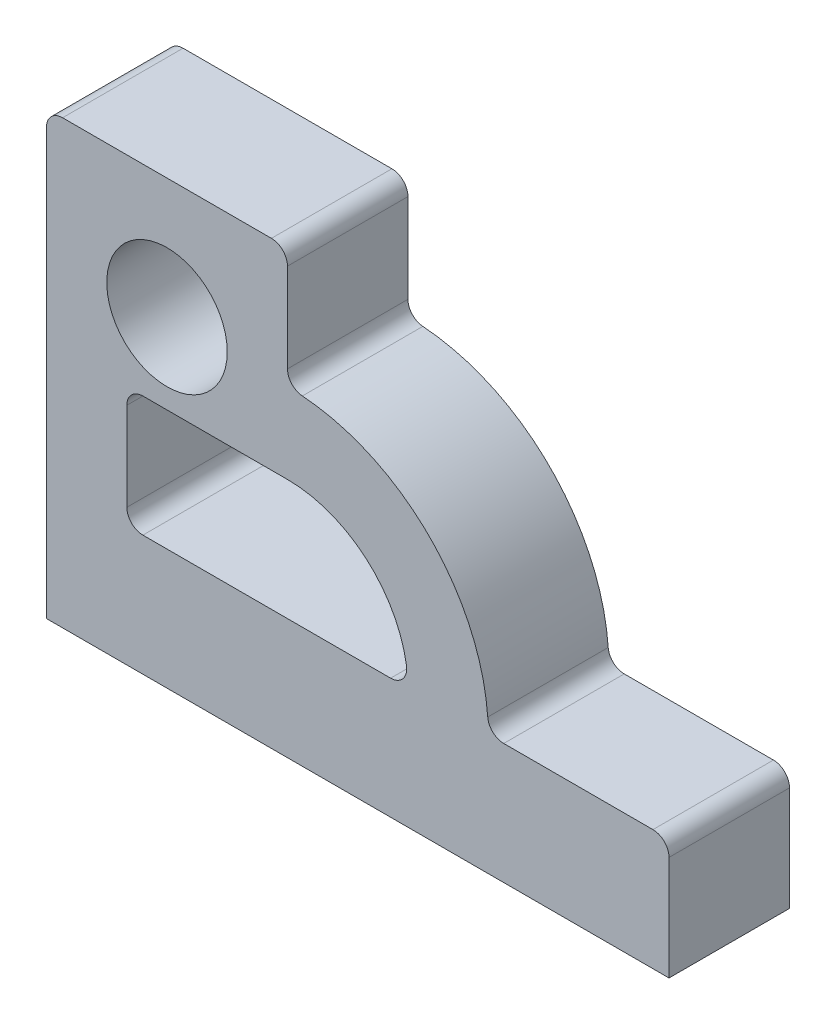
ISO-10303-21;
HEADER;
FILE_DESCRIPTION(('STEP AP214'),'2;1');
FILE_NAME('part.step','',(''),(''),'','','');
FILE_SCHEMA(('AUTOMOTIVE_DESIGN { 1 0 10303 214 1 1 1 1 }'));
ENDSEC;
DATA;
#1=APPLICATION_CONTEXT('core data for automotive mechanical design processes');
#2=APPLICATION_PROTOCOL_DEFINITION('international standard','automotive_design',2000,#1);
#3=PRODUCT_CONTEXT('',#1,'mechanical');
#4=PRODUCT('Part','Part','',(#3));
#5=PRODUCT_RELATED_PRODUCT_CATEGORY('part','',(#4));
#6=PRODUCT_DEFINITION_FORMATION('','',#4);
#7=PRODUCT_DEFINITION_CONTEXT('part definition',#1,'design');
#8=PRODUCT_DEFINITION('design','',#6,#7);
#9=PRODUCT_DEFINITION_SHAPE('','',#8);
#10=(LENGTH_UNIT() NAMED_UNIT(*) SI_UNIT(.MILLI.,.METRE.));
#11=(NAMED_UNIT(*) PLANE_ANGLE_UNIT() SI_UNIT($,.RADIAN.));
#12=(NAMED_UNIT(*) SI_UNIT($,.STERADIAN.) SOLID_ANGLE_UNIT());
#13=UNCERTAINTY_MEASURE_WITH_UNIT(LENGTH_MEASURE(1.E-05),#10,'distance_accuracy_value','');
#14=(GEOMETRIC_REPRESENTATION_CONTEXT(3) GLOBAL_UNCERTAINTY_ASSIGNED_CONTEXT((#13)) GLOBAL_UNIT_ASSIGNED_CONTEXT((#10,
#11,#12)) REPRESENTATION_CONTEXT('',''));
#15=CARTESIAN_POINT('',(0.,0.,0.));
#16=DIRECTION('',(0.,0.,1.));
#17=DIRECTION('',(1.,0.,0.));
#18=AXIS2_PLACEMENT_3D('',#15,#16,#17);
#19=CARTESIAN_POINT('',(4.,106.,15.));
#20=DIRECTION('',(0.,0.,-1.));
#21=DIRECTION('',(-1.,0.,0.));
#22=AXIS2_PLACEMENT_3D('',#19,#20,#21);
#23=PLANE('',#22);
#24=DIRECTION('',(1.,0.,0.));
#25=VECTOR('',#24,1.);
#26=CARTESIAN_POINT('',(155.,0.,15.));
#27=LINE('',#26,#25);
#28=CARTESIAN_POINT('',(0.,0.,15.));
#29=VERTEX_POINT('',#28);
#30=CARTESIAN_POINT('',(155.,0.,15.));
#31=VERTEX_POINT('',#30);
#32=EDGE_CURVE('E225',#29,#31,#27,.T.);
#33=ORIENTED_EDGE('',*,*,#32,.T.);
#34=DIRECTION('',(0.,1.,0.));
#35=VECTOR('',#34,1.);
#36=CARTESIAN_POINT('',(155.,26.,15.));
#37=LINE('',#36,#35);
#38=CARTESIAN_POINT('',(155.,26.,15.));
#39=VERTEX_POINT('',#38);
#40=EDGE_CURVE('E228',#31,#39,#37,.T.);
#41=ORIENTED_EDGE('',*,*,#40,.T.);
#42=CARTESIAN_POINT('',(151.,26.,15.));
#43=DIRECTION('',(0.,0.,1.));
#44=DIRECTION('',(-1.,0.,0.));
#45=AXIS2_PLACEMENT_3D('',#42,#43,#44);
#46=CIRCLE('',#45,4.);
#47=CARTESIAN_POINT('',(151.,30.,15.));
#48=VERTEX_POINT('',#47);
#49=EDGE_CURVE('E231',#39,#48,#46,.T.);
#50=ORIENTED_EDGE('',*,*,#49,.T.);
#51=DIRECTION('',(-1.,0.,0.));
#52=VECTOR('',#51,1.);
#53=CARTESIAN_POINT('',(113.851648071345,30.,15.));
#54=LINE('',#53,#52);
#55=CARTESIAN_POINT('',(113.851648071345,30.,15.));
#56=VERTEX_POINT('',#55);
#57=EDGE_CURVE('E233',#48,#56,#54,.T.);
#58=ORIENTED_EDGE('',*,*,#57,.T.);
#59=CARTESIAN_POINT('',(113.851648071345,34.,15.));
#60=DIRECTION('',(0.,0.,-1.));
#61=DIRECTION('',(1.,0.,0.));
#62=AXIS2_PLACEMENT_3D('',#59,#60,#61);
#63=CIRCLE('',#62,4.);
#64=CARTESIAN_POINT('',(109.862637103097,33.7037037037037,15.));
#65=VERTEX_POINT('',#64);
#66=EDGE_CURVE('E235',#56,#65,#63,.T.);
#67=ORIENTED_EDGE('',*,*,#66,.T.);
#68=CARTESIAN_POINT('',(60.,30.,15.));
#69=DIRECTION('',(0.,0.,1.));
#70=DIRECTION('',(-1.,0.,0.));
#71=AXIS2_PLACEMENT_3D('',#68,#69,#70);
#72=CIRCLE('',#71,50.);
#73=CARTESIAN_POINT('',(63.7037037037037,79.8626371030973,15.));
#74=VERTEX_POINT('',#73);
#75=EDGE_CURVE('E237',#65,#74,#72,.T.);
#76=ORIENTED_EDGE('',*,*,#75,.T.);
#77=CARTESIAN_POINT('',(64.,83.851648071345,15.));
#78=DIRECTION('',(0.,0.,-1.));
#79=DIRECTION('',(1.,0.,0.));
#80=AXIS2_PLACEMENT_3D('',#77,#78,#79);
#81=CIRCLE('',#80,4.00000000000001);
#82=CARTESIAN_POINT('',(60.,83.851648071345,15.));
#83=VERTEX_POINT('',#82);
#84=EDGE_CURVE('E239',#74,#83,#81,.T.);
#85=ORIENTED_EDGE('',*,*,#84,.T.);
#86=DIRECTION('',(0.,1.,0.));
#87=VECTOR('',#86,1.);
#88=CARTESIAN_POINT('',(60.,106.,15.));
#89=LINE('',#88,#87);
#90=CARTESIAN_POINT('',(60.,106.,15.));
#91=VERTEX_POINT('',#90);
#92=EDGE_CURVE('E241',#83,#91,#89,.T.);
#93=ORIENTED_EDGE('',*,*,#92,.T.);
#94=CARTESIAN_POINT('',(56.,106.,15.));
#95=DIRECTION('',(0.,0.,1.));
#96=DIRECTION('',(-1.,0.,0.));
#97=AXIS2_PLACEMENT_3D('',#94,#95,#96);
#98=CIRCLE('',#97,4.);
#99=CARTESIAN_POINT('',(55.9999999999999,110.,15.));
#100=VERTEX_POINT('',#99);
#101=EDGE_CURVE('E243',#91,#100,#98,.T.);
#102=ORIENTED_EDGE('',*,*,#101,.T.);
#103=DIRECTION('',(-1.,0.,0.));
#104=VECTOR('',#103,1.);
#105=CARTESIAN_POINT('',(4.00000000000003,110.,15.));
#106=LINE('',#105,#104);
#107=CARTESIAN_POINT('',(4.00000000000003,110.,15.));
#108=VERTEX_POINT('',#107);
#109=EDGE_CURVE('E245',#100,#108,#106,.T.);
#110=ORIENTED_EDGE('',*,*,#109,.T.);
#111=CARTESIAN_POINT('',(4.,106.,15.));
#112=DIRECTION('',(0.,0.,1.));
#113=DIRECTION('',(-1.,0.,0.));
#114=AXIS2_PLACEMENT_3D('',#111,#112,#113);
#115=CIRCLE('',#114,4.);
#116=CARTESIAN_POINT('',(0.,106.,15.));
#117=VERTEX_POINT('',#116);
#118=EDGE_CURVE('E247',#108,#117,#115,.T.);
#119=ORIENTED_EDGE('',*,*,#118,.T.);
#120=DIRECTION('',(0.,-1.,0.));
#121=VECTOR('',#120,1.);
#122=CARTESIAN_POINT('',(0.,0.,15.));
#123=LINE('',#122,#121);
#124=EDGE_CURVE('E249',#117,#29,#123,.T.);
#125=ORIENTED_EDGE('',*,*,#124,.T.);
#126=EDGE_LOOP('',(#33,#41,#50,#58,#67,#76,#85,#93,#102,#110,#119,#125));
#127=FACE_BOUND('',#126,.T.);
#128=CARTESIAN_POINT('',(60.,30.,15.));
#129=DIRECTION('',(0.,0.,1.));
#130=DIRECTION('',(-1.,0.,0.));
#131=AXIS2_PLACEMENT_3D('',#128,#129,#130);
#132=CIRCLE('',#131,30.);
#133=CARTESIAN_POINT('',(89.6428444123041,34.6153846153846,15.));
#134=VERTEX_POINT('',#133);
#135=CARTESIAN_POINT('',(60.,60.,15.));
#136=VERTEX_POINT('',#135);
#137=EDGE_CURVE('E164',#134,#136,#132,.T.);
#138=ORIENTED_EDGE('',*,*,#137,.F.);
#139=CARTESIAN_POINT('',(85.6904651573303,34.,15.));
#140=DIRECTION('',(0.,0.,1.));
#141=DIRECTION('',(1.,0.,0.));
#142=AXIS2_PLACEMENT_3D('',#139,#140,#141);
#143=CIRCLE('',#142,4.);
#144=CARTESIAN_POINT('',(85.6904651573303,30.,15.));
#145=VERTEX_POINT('',#144);
#146=EDGE_CURVE('E197',#145,#134,#143,.T.);
#147=ORIENTED_EDGE('',*,*,#146,.F.);
#148=DIRECTION('',(1.,0.,0.));
#149=VECTOR('',#148,1.);
#150=CARTESIAN_POINT('',(85.6904651573303,30.,15.));
#151=LINE('',#150,#149);
#152=CARTESIAN_POINT('',(24.,30.,15.));
#153=VERTEX_POINT('',#152);
#154=EDGE_CURVE('E195',#153,#145,#151,.T.);
#155=ORIENTED_EDGE('',*,*,#154,.F.);
#156=CARTESIAN_POINT('',(24.,34.,15.));
#157=DIRECTION('',(0.,0.,1.));
#158=DIRECTION('',(-1.,0.,0.));
#159=AXIS2_PLACEMENT_3D('',#156,#157,#158);
#160=CIRCLE('',#159,4.);
#161=CARTESIAN_POINT('',(20.,34.,15.));
#162=VERTEX_POINT('',#161);
#163=EDGE_CURVE('E193',#162,#153,#160,.T.);
#164=ORIENTED_EDGE('',*,*,#163,.F.);
#165=DIRECTION('',(0.,-1.,0.));
#166=VECTOR('',#165,1.);
#167=CARTESIAN_POINT('',(20.,34.,15.));
#168=LINE('',#167,#166);
#169=CARTESIAN_POINT('',(20.,56.,15.));
#170=VERTEX_POINT('',#169);
#171=EDGE_CURVE('E188',#170,#162,#168,.T.);
#172=ORIENTED_EDGE('',*,*,#171,.F.);
#173=CARTESIAN_POINT('',(24.,56.,15.));
#174=DIRECTION('',(0.,0.,1.));
#175=DIRECTION('',(-1.,0.,0.));
#176=AXIS2_PLACEMENT_3D('',#173,#174,#175);
#177=CIRCLE('',#176,4.);
#178=CARTESIAN_POINT('',(24.,60.,15.));
#179=VERTEX_POINT('',#178);
#180=EDGE_CURVE('E186',#179,#170,#177,.T.);
#181=ORIENTED_EDGE('',*,*,#180,.F.);
#182=DIRECTION('',(-1.,0.,0.));
#183=VECTOR('',#182,1.);
#184=CARTESIAN_POINT('',(24.,60.,15.));
#185=LINE('',#184,#183);
#186=EDGE_CURVE('E172',#136,#179,#185,.T.);
#187=ORIENTED_EDGE('',*,*,#186,.F.);
#188=EDGE_LOOP('',(#138,#147,#155,#164,#172,#181,#187));
#189=FACE_BOUND('',#188,.T.);
#190=CARTESIAN_POINT('',(30.,80.,15.));
#191=DIRECTION('',(0.,0.,1.));
#192=DIRECTION('',(1.,0.,0.));
#193=AXIS2_PLACEMENT_3D('',#190,#191,#192);
#194=CIRCLE('',#193,15.);
#195=CARTESIAN_POINT('',(45.,80.,15.));
#196=VERTEX_POINT('',#195);
#197=EDGE_CURVE('E200',#196,#196,#194,.T.);
#198=ORIENTED_EDGE('',*,*,#197,.F.);
#199=EDGE_LOOP('',(#198));
#200=FACE_BOUND('',#199,.T.);
#201=ADVANCED_FACE('F33',(#127,#189,#200),#23,.F.);
#202=CARTESIAN_POINT('',(4.,106.,-15.));
#203=DIRECTION('',(0.,0.,-1.));
#204=DIRECTION('',(-1.,0.,0.));
#205=AXIS2_PLACEMENT_3D('',#202,#203,#204);
#206=PLANE('',#205);
#207=CARTESIAN_POINT('',(85.6904651573303,34.,-15.));
#208=DIRECTION('',(0.,0.,1.));
#209=DIRECTION('',(1.,0.,0.));
#210=AXIS2_PLACEMENT_3D('',#207,#208,#209);
#211=CIRCLE('',#210,4.);
#212=CARTESIAN_POINT('',(85.6904651573303,30.,-15.));
#213=VERTEX_POINT('',#212);
#214=CARTESIAN_POINT('',(89.6428444123041,34.6153846153846,-15.));
#215=VERTEX_POINT('',#214);
#216=EDGE_CURVE('E173',#213,#215,#211,.T.);
#217=ORIENTED_EDGE('',*,*,#216,.T.);
#218=CARTESIAN_POINT('',(60.,30.,-15.));
#219=DIRECTION('',(0.,0.,1.));
#220=DIRECTION('',(-1.,0.,0.));
#221=AXIS2_PLACEMENT_3D('',#218,#219,#220);
#222=CIRCLE('',#221,30.);
#223=CARTESIAN_POINT('',(60.,60.,-15.));
#224=VERTEX_POINT('',#223);
#225=EDGE_CURVE('E56',#215,#224,#222,.T.);
#226=ORIENTED_EDGE('',*,*,#225,.T.);
#227=DIRECTION('',(-1.,0.,0.));
#228=VECTOR('',#227,1.);
#229=CARTESIAN_POINT('',(24.,60.,-15.));
#230=LINE('',#229,#228);
#231=CARTESIAN_POINT('',(24.,60.,-15.));
#232=VERTEX_POINT('',#231);
#233=EDGE_CURVE('E179',#224,#232,#230,.T.);
#234=ORIENTED_EDGE('',*,*,#233,.T.);
#235=CARTESIAN_POINT('',(24.,56.,-15.));
#236=DIRECTION('',(0.,0.,1.));
#237=DIRECTION('',(-1.,0.,0.));
#238=AXIS2_PLACEMENT_3D('',#235,#236,#237);
#239=CIRCLE('',#238,4.);
#240=CARTESIAN_POINT('',(20.,56.,-15.));
#241=VERTEX_POINT('',#240);
#242=EDGE_CURVE('E202',#232,#241,#239,.T.);
#243=ORIENTED_EDGE('',*,*,#242,.T.);
#244=DIRECTION('',(0.,-1.,0.));
#245=VECTOR('',#244,1.);
#246=CARTESIAN_POINT('',(20.,34.,-15.));
#247=LINE('',#246,#245);
#248=CARTESIAN_POINT('',(20.,34.,-15.));
#249=VERTEX_POINT('',#248);
#250=EDGE_CURVE('E205',#241,#249,#247,.T.);
#251=ORIENTED_EDGE('',*,*,#250,.T.);
#252=CARTESIAN_POINT('',(24.,34.,-15.));
#253=DIRECTION('',(0.,0.,1.));
#254=DIRECTION('',(-1.,0.,0.));
#255=AXIS2_PLACEMENT_3D('',#252,#253,#254);
#256=CIRCLE('',#255,4.);
#257=CARTESIAN_POINT('',(24.,30.,-15.));
#258=VERTEX_POINT('',#257);
#259=EDGE_CURVE('E208',#249,#258,#256,.T.);
#260=ORIENTED_EDGE('',*,*,#259,.T.);
#261=DIRECTION('',(1.,0.,0.));
#262=VECTOR('',#261,1.);
#263=CARTESIAN_POINT('',(85.6904651573303,30.,-15.));
#264=LINE('',#263,#262);
#265=EDGE_CURVE('E211',#258,#213,#264,.T.);
#266=ORIENTED_EDGE('',*,*,#265,.T.);
#267=EDGE_LOOP('',(#217,#226,#234,#243,#251,#260,#266));
#268=FACE_BOUND('',#267,.T.);
#269=DIRECTION('',(1.,0.,0.));
#270=VECTOR('',#269,1.);
#271=CARTESIAN_POINT('',(155.,0.,-15.));
#272=LINE('',#271,#270);
#273=CARTESIAN_POINT('',(0.,0.,-15.));
#274=VERTEX_POINT('',#273);
#275=CARTESIAN_POINT('',(155.,0.,-15.));
#276=VERTEX_POINT('',#275);
#277=EDGE_CURVE('E180',#274,#276,#272,.T.);
#278=ORIENTED_EDGE('',*,*,#277,.F.);
#279=DIRECTION('',(0.,-1.,0.));
#280=VECTOR('',#279,1.);
#281=CARTESIAN_POINT('',(0.,0.,-15.));
#282=LINE('',#281,#280);
#283=CARTESIAN_POINT('',(0.,106.,-15.));
#284=VERTEX_POINT('',#283);
#285=EDGE_CURVE('E229',#284,#274,#282,.T.);
#286=ORIENTED_EDGE('',*,*,#285,.F.);
#287=CARTESIAN_POINT('',(4.,106.,-15.));
#288=DIRECTION('',(0.,0.,1.));
#289=DIRECTION('',(-1.,0.,0.));
#290=AXIS2_PLACEMENT_3D('',#287,#288,#289);
#291=CIRCLE('',#290,4.);
#292=CARTESIAN_POINT('',(4.00000000000003,110.,-15.));
#293=VERTEX_POINT('',#292);
#294=EDGE_CURVE('E272',#293,#284,#291,.T.);
#295=ORIENTED_EDGE('',*,*,#294,.F.);
#296=DIRECTION('',(-1.,0.,0.));
#297=VECTOR('',#296,1.);
#298=CARTESIAN_POINT('',(4.00000000000003,110.,-15.));
#299=LINE('',#298,#297);
#300=CARTESIAN_POINT('',(55.9999999999999,110.,-15.));
#301=VERTEX_POINT('',#300);
#302=EDGE_CURVE('E270',#301,#293,#299,.T.);
#303=ORIENTED_EDGE('',*,*,#302,.F.);
#304=CARTESIAN_POINT('',(56.,106.,-15.));
#305=DIRECTION('',(0.,0.,1.));
#306=DIRECTION('',(-1.,0.,0.));
#307=AXIS2_PLACEMENT_3D('',#304,#305,#306);
#308=CIRCLE('',#307,4.);
#309=CARTESIAN_POINT('',(60.,106.,-15.));
#310=VERTEX_POINT('',#309);
#311=EDGE_CURVE('E268',#310,#301,#308,.T.);
#312=ORIENTED_EDGE('',*,*,#311,.F.);
#313=DIRECTION('',(0.,1.,0.));
#314=VECTOR('',#313,1.);
#315=CARTESIAN_POINT('',(60.,106.,-15.));
#316=LINE('',#315,#314);
#317=CARTESIAN_POINT('',(60.,83.851648071345,-15.));
#318=VERTEX_POINT('',#317);
#319=EDGE_CURVE('E266',#318,#310,#316,.T.);
#320=ORIENTED_EDGE('',*,*,#319,.F.);
#321=CARTESIAN_POINT('',(64.,83.851648071345,-15.));
#322=DIRECTION('',(0.,0.,-1.));
#323=DIRECTION('',(1.,0.,0.));
#324=AXIS2_PLACEMENT_3D('',#321,#322,#323);
#325=CIRCLE('',#324,4.00000000000001);
#326=CARTESIAN_POINT('',(63.7037037037037,79.8626371030973,-15.));
#327=VERTEX_POINT('',#326);
#328=EDGE_CURVE('E264',#327,#318,#325,.T.);
#329=ORIENTED_EDGE('',*,*,#328,.F.);
#330=CARTESIAN_POINT('',(60.,30.,-15.));
#331=DIRECTION('',(0.,0.,1.));
#332=DIRECTION('',(-1.,0.,0.));
#333=AXIS2_PLACEMENT_3D('',#330,#331,#332);
#334=CIRCLE('',#333,50.);
#335=CARTESIAN_POINT('',(109.862637103097,33.7037037037037,-15.));
#336=VERTEX_POINT('',#335);
#337=EDGE_CURVE('E262',#336,#327,#334,.T.);
#338=ORIENTED_EDGE('',*,*,#337,.F.);
#339=CARTESIAN_POINT('',(113.851648071345,34.,-15.));
#340=DIRECTION('',(0.,0.,-1.));
#341=DIRECTION('',(1.,0.,0.));
#342=AXIS2_PLACEMENT_3D('',#339,#340,#341);
#343=CIRCLE('',#342,4.);
#344=CARTESIAN_POINT('',(113.851648071345,30.,-15.));
#345=VERTEX_POINT('',#344);
#346=EDGE_CURVE('E260',#345,#336,#343,.T.);
#347=ORIENTED_EDGE('',*,*,#346,.F.);
#348=DIRECTION('',(-1.,0.,0.));
#349=VECTOR('',#348,1.);
#350=CARTESIAN_POINT('',(113.851648071345,30.,-15.));
#351=LINE('',#350,#349);
#352=CARTESIAN_POINT('',(151.,30.,-15.));
#353=VERTEX_POINT('',#352);
#354=EDGE_CURVE('E258',#353,#345,#351,.T.);
#355=ORIENTED_EDGE('',*,*,#354,.F.);
#356=CARTESIAN_POINT('',(151.,26.,-15.));
#357=DIRECTION('',(0.,0.,1.));
#358=DIRECTION('',(-1.,0.,0.));
#359=AXIS2_PLACEMENT_3D('',#356,#357,#358);
#360=CIRCLE('',#359,4.);
#361=CARTESIAN_POINT('',(155.,26.,-15.));
#362=VERTEX_POINT('',#361);
#363=EDGE_CURVE('E256',#362,#353,#360,.T.);
#364=ORIENTED_EDGE('',*,*,#363,.F.);
#365=DIRECTION('',(0.,1.,0.));
#366=VECTOR('',#365,1.);
#367=CARTESIAN_POINT('',(155.,26.,-15.));
#368=LINE('',#367,#366);
#369=EDGE_CURVE('E254',#276,#362,#368,.T.);
#370=ORIENTED_EDGE('',*,*,#369,.F.);
#371=EDGE_LOOP('',(#278,#286,#295,#303,#312,#320,#329,#338,#347,#355,#364,#370));
#372=FACE_BOUND('',#371,.T.);
#373=CARTESIAN_POINT('',(30.,80.,-15.));
#374=DIRECTION('',(0.,0.,1.));
#375=DIRECTION('',(1.,0.,0.));
#376=AXIS2_PLACEMENT_3D('',#373,#374,#375);
#377=CIRCLE('',#376,15.);
#378=CARTESIAN_POINT('',(45.,80.,-15.));
#379=VERTEX_POINT('',#378);
#380=EDGE_CURVE('E556',#379,#379,#377,.T.);
#381=ORIENTED_EDGE('',*,*,#380,.T.);
#382=EDGE_LOOP('',(#381));
#383=FACE_BOUND('',#382,.T.);
#384=ADVANCED_FACE('F314',(#268,#372,#383),#206,.T.);
#385=CARTESIAN_POINT('',(155.,0.,15.));
#386=DIRECTION('',(0.,1.,0.));
#387=DIRECTION('',(-1.,0.,0.));
#388=AXIS2_PLACEMENT_3D('',#385,#386,#387);
#389=PLANE('',#388);
#390=ORIENTED_EDGE('',*,*,#277,.T.);
#391=DIRECTION('',(0.,0.,-1.));
#392=VECTOR('',#391,1.);
#393=CARTESIAN_POINT('',(155.,0.,15.));
#394=LINE('',#393,#392);
#395=EDGE_CURVE('E11',#31,#276,#394,.T.);
#396=ORIENTED_EDGE('',*,*,#395,.F.);
#397=ORIENTED_EDGE('',*,*,#32,.F.);
#398=DIRECTION('',(0.,0.,-1.));
#399=VECTOR('',#398,1.);
#400=CARTESIAN_POINT('',(0.,0.,15.));
#401=LINE('',#400,#399);
#402=EDGE_CURVE('E251',#29,#274,#401,.T.);
#403=ORIENTED_EDGE('',*,*,#402,.T.);
#404=EDGE_LOOP('',(#390,#396,#397,#403));
#405=FACE_BOUND('',#404,.T.);
#406=ADVANCED_FACE('F35',(#405),#389,.F.);
#407=CARTESIAN_POINT('',(155.,26.,15.));
#408=DIRECTION('',(-1.,0.,0.));
#409=DIRECTION('',(0.,0.,1.));
#410=AXIS2_PLACEMENT_3D('',#407,#408,#409);
#411=PLANE('',#410);
#412=ORIENTED_EDGE('',*,*,#369,.T.);
#413=DIRECTION('',(0.,0.,-1.));
#414=VECTOR('',#413,1.);
#415=CARTESIAN_POINT('',(155.,26.,15.));
#416=LINE('',#415,#414);
#417=EDGE_CURVE('E41',#39,#362,#416,.T.);
#418=ORIENTED_EDGE('',*,*,#417,.F.);
#419=ORIENTED_EDGE('',*,*,#40,.F.);
#420=ORIENTED_EDGE('',*,*,#395,.T.);
#421=EDGE_LOOP('',(#412,#418,#419,#420));
#422=FACE_BOUND('',#421,.T.);
#423=ADVANCED_FACE('F331',(#422),#411,.F.);
#424=CARTESIAN_POINT('',(151.,26.,15.));
#425=DIRECTION('',(0.,0.,-1.));
#426=DIRECTION('',(-1.,0.,0.));
#427=AXIS2_PLACEMENT_3D('',#424,#425,#426);
#428=CYLINDRICAL_SURFACE('',#427,4.);
#429=ORIENTED_EDGE('',*,*,#363,.T.);
#430=DIRECTION('',(0.,0.,-1.));
#431=VECTOR('',#430,1.);
#432=CARTESIAN_POINT('',(151.,30.,15.));
#433=LINE('',#432,#431);
#434=EDGE_CURVE('E301',#48,#353,#433,.T.);
#435=ORIENTED_EDGE('',*,*,#434,.F.);
#436=ORIENTED_EDGE('',*,*,#49,.F.);
#437=ORIENTED_EDGE('',*,*,#417,.T.);
#438=EDGE_LOOP('',(#429,#435,#436,#437));
#439=FACE_BOUND('',#438,.T.);
#440=ADVANCED_FACE('F308',(#439),#428,.T.);
#441=CARTESIAN_POINT('',(113.851648071345,30.,15.));
#442=DIRECTION('',(0.,-1.,0.));
#443=DIRECTION('',(0.,0.,-1.));
#444=AXIS2_PLACEMENT_3D('',#441,#442,#443);
#445=PLANE('',#444);
#446=ORIENTED_EDGE('',*,*,#354,.T.);
#447=DIRECTION('',(0.,0.,-1.));
#448=VECTOR('',#447,1.);
#449=CARTESIAN_POINT('',(113.851648071345,30.,15.));
#450=LINE('',#449,#448);
#451=EDGE_CURVE('E298',#56,#345,#450,.T.);
#452=ORIENTED_EDGE('',*,*,#451,.F.);
#453=ORIENTED_EDGE('',*,*,#57,.F.);
#454=ORIENTED_EDGE('',*,*,#434,.T.);
#455=EDGE_LOOP('',(#446,#452,#453,#454));
#456=FACE_BOUND('',#455,.T.);
#457=ADVANCED_FACE('F320',(#456),#445,.F.);
#458=CARTESIAN_POINT('',(113.851648071345,34.,15.));
#459=DIRECTION('',(0.,0.,-1.));
#460=DIRECTION('',(-1.,0.,0.));
#461=AXIS2_PLACEMENT_3D('',#458,#459,#460);
#462=CYLINDRICAL_SURFACE('',#461,4.);
#463=ORIENTED_EDGE('',*,*,#346,.T.);
#464=DIRECTION('',(0.,0.,-1.));
#465=VECTOR('',#464,1.);
#466=CARTESIAN_POINT('',(109.862637103097,33.7037037037037,15.));
#467=LINE('',#466,#465);
#468=EDGE_CURVE('E295',#65,#336,#467,.T.);
#469=ORIENTED_EDGE('',*,*,#468,.F.);
#470=ORIENTED_EDGE('',*,*,#66,.F.);
#471=ORIENTED_EDGE('',*,*,#451,.T.);
#472=EDGE_LOOP('',(#463,#469,#470,#471));
#473=FACE_BOUND('',#472,.T.);
#474=ADVANCED_FACE('F324',(#473),#462,.F.);
#475=CARTESIAN_POINT('',(60.,30.,15.));
#476=DIRECTION('',(0.,0.,-1.));
#477=DIRECTION('',(-1.,0.,0.));
#478=AXIS2_PLACEMENT_3D('',#475,#476,#477);
#479=CYLINDRICAL_SURFACE('',#478,50.);
#480=ORIENTED_EDGE('',*,*,#337,.T.);
#481=DIRECTION('',(0.,0.,-1.));
#482=VECTOR('',#481,1.);
#483=CARTESIAN_POINT('',(63.7037037037037,79.8626371030973,15.));
#484=LINE('',#483,#482);
#485=EDGE_CURVE('E292',#74,#327,#484,.T.);
#486=ORIENTED_EDGE('',*,*,#485,.F.);
#487=ORIENTED_EDGE('',*,*,#75,.F.);
#488=ORIENTED_EDGE('',*,*,#468,.T.);
#489=EDGE_LOOP('',(#480,#486,#487,#488));
#490=FACE_BOUND('',#489,.T.);
#491=ADVANCED_FACE('F364',(#490),#479,.T.);
#492=CARTESIAN_POINT('',(64.,83.851648071345,15.));
#493=DIRECTION('',(0.,0.,-1.));
#494=DIRECTION('',(-1.,0.,0.));
#495=AXIS2_PLACEMENT_3D('',#492,#493,#494);
#496=CYLINDRICAL_SURFACE('',#495,4.00000000000001);
#497=ORIENTED_EDGE('',*,*,#328,.T.);
#498=DIRECTION('',(0.,0.,-1.));
#499=VECTOR('',#498,1.);
#500=CARTESIAN_POINT('',(60.,83.851648071345,15.));
#501=LINE('',#500,#499);
#502=EDGE_CURVE('E289',#83,#318,#501,.T.);
#503=ORIENTED_EDGE('',*,*,#502,.F.);
#504=ORIENTED_EDGE('',*,*,#84,.F.);
#505=ORIENTED_EDGE('',*,*,#485,.T.);
#506=EDGE_LOOP('',(#497,#503,#504,#505));
#507=FACE_BOUND('',#506,.T.);
#508=ADVANCED_FACE('F362',(#507),#496,.F.);
#509=CARTESIAN_POINT('',(60.,106.,15.));
#510=DIRECTION('',(-1.,0.,0.));
#511=DIRECTION('',(0.,0.,1.));
#512=AXIS2_PLACEMENT_3D('',#509,#510,#511);
#513=PLANE('',#512);
#514=ORIENTED_EDGE('',*,*,#319,.T.);
#515=DIRECTION('',(0.,0.,-1.));
#516=VECTOR('',#515,1.);
#517=CARTESIAN_POINT('',(60.,106.,15.));
#518=LINE('',#517,#516);
#519=EDGE_CURVE('E286',#91,#310,#518,.T.);
#520=ORIENTED_EDGE('',*,*,#519,.F.);
#521=ORIENTED_EDGE('',*,*,#92,.F.);
#522=ORIENTED_EDGE('',*,*,#502,.T.);
#523=EDGE_LOOP('',(#514,#520,#521,#522));
#524=FACE_BOUND('',#523,.T.);
#525=ADVANCED_FACE('F358',(#524),#513,.F.);
#526=CARTESIAN_POINT('',(56.,106.,15.));
#527=DIRECTION('',(0.,0.,-1.));
#528=DIRECTION('',(-1.,0.,0.));
#529=AXIS2_PLACEMENT_3D('',#526,#527,#528);
#530=CYLINDRICAL_SURFACE('',#529,4.);
#531=ORIENTED_EDGE('',*,*,#311,.T.);
#532=DIRECTION('',(0.,0.,-1.));
#533=VECTOR('',#532,1.);
#534=CARTESIAN_POINT('',(55.9999999999999,110.,15.));
#535=LINE('',#534,#533);
#536=EDGE_CURVE('E283',#100,#301,#535,.T.);
#537=ORIENTED_EDGE('',*,*,#536,.F.);
#538=ORIENTED_EDGE('',*,*,#101,.F.);
#539=ORIENTED_EDGE('',*,*,#519,.T.);
#540=EDGE_LOOP('',(#531,#537,#538,#539));
#541=FACE_BOUND('',#540,.T.);
#542=ADVANCED_FACE('F353',(#541),#530,.T.);
#543=CARTESIAN_POINT('',(4.00000000000003,110.,15.));
#544=DIRECTION('',(0.,-1.,0.));
#545=DIRECTION('',(1.,0.,0.));
#546=AXIS2_PLACEMENT_3D('',#543,#544,#545);
#547=PLANE('',#546);
#548=ORIENTED_EDGE('',*,*,#302,.T.);
#549=DIRECTION('',(0.,0.,-1.));
#550=VECTOR('',#549,1.);
#551=CARTESIAN_POINT('',(4.00000000000003,110.,15.));
#552=LINE('',#551,#550);
#553=EDGE_CURVE('E280',#108,#293,#552,.T.);
#554=ORIENTED_EDGE('',*,*,#553,.F.);
#555=ORIENTED_EDGE('',*,*,#109,.F.);
#556=ORIENTED_EDGE('',*,*,#536,.T.);
#557=EDGE_LOOP('',(#548,#554,#555,#556));
#558=FACE_BOUND('',#557,.T.);
#559=ADVANCED_FACE('F347',(#558),#547,.F.);
#560=CARTESIAN_POINT('',(4.,106.,15.));
#561=DIRECTION('',(0.,0.,-1.));
#562=DIRECTION('',(-1.,0.,0.));
#563=AXIS2_PLACEMENT_3D('',#560,#561,#562);
#564=CYLINDRICAL_SURFACE('',#563,4.);
#565=ORIENTED_EDGE('',*,*,#294,.T.);
#566=DIRECTION('',(0.,0.,-1.));
#567=VECTOR('',#566,1.);
#568=CARTESIAN_POINT('',(0.,106.,15.));
#569=LINE('',#568,#567);
#570=EDGE_CURVE('E277',#117,#284,#569,.T.);
#571=ORIENTED_EDGE('',*,*,#570,.F.);
#572=ORIENTED_EDGE('',*,*,#118,.F.);
#573=ORIENTED_EDGE('',*,*,#553,.T.);
#574=EDGE_LOOP('',(#565,#571,#572,#573));
#575=FACE_BOUND('',#574,.T.);
#576=ADVANCED_FACE('F343',(#575),#564,.T.);
#577=CARTESIAN_POINT('',(0.,0.,15.));
#578=DIRECTION('',(1.,0.,0.));
#579=DIRECTION('',(0.,0.,-1.));
#580=AXIS2_PLACEMENT_3D('',#577,#578,#579);
#581=PLANE('',#580);
#582=ORIENTED_EDGE('',*,*,#285,.T.);
#583=ORIENTED_EDGE('',*,*,#402,.F.);
#584=ORIENTED_EDGE('',*,*,#124,.F.);
#585=ORIENTED_EDGE('',*,*,#570,.T.);
#586=EDGE_LOOP('',(#582,#583,#584,#585));
#587=FACE_BOUND('',#586,.T.);
#588=ADVANCED_FACE('F338',(#587),#581,.F.);
#589=CARTESIAN_POINT('',(60.,30.,15.));
#590=DIRECTION('',(0.,0.,-1.));
#591=DIRECTION('',(-1.,0.,0.));
#592=AXIS2_PLACEMENT_3D('',#589,#590,#591);
#593=CYLINDRICAL_SURFACE('',#592,30.);
#594=ORIENTED_EDGE('',*,*,#225,.F.);
#595=DIRECTION('',(0.,0.,-1.));
#596=VECTOR('',#595,1.);
#597=CARTESIAN_POINT('',(89.6428444123041,34.6153846153846,15.));
#598=LINE('',#597,#596);
#599=EDGE_CURVE('E168',#134,#215,#598,.T.);
#600=ORIENTED_EDGE('',*,*,#599,.F.);
#601=ORIENTED_EDGE('',*,*,#137,.T.);
#602=DIRECTION('',(0.,0.,-1.));
#603=VECTOR('',#602,1.);
#604=CARTESIAN_POINT('',(60.,60.,15.));
#605=LINE('',#604,#603);
#606=EDGE_CURVE('E167',#136,#224,#605,.T.);
#607=ORIENTED_EDGE('',*,*,#606,.T.);
#608=EDGE_LOOP('',(#594,#600,#601,#607));
#609=FACE_BOUND('',#608,.T.);
#610=ADVANCED_FACE('F166',(#609),#593,.F.);
#611=CARTESIAN_POINT('',(24.,60.,15.));
#612=DIRECTION('',(0.,-1.,0.));
#613=DIRECTION('',(0.,0.,-1.));
#614=AXIS2_PLACEMENT_3D('',#611,#612,#613);
#615=PLANE('',#614);
#616=ORIENTED_EDGE('',*,*,#233,.F.);
#617=ORIENTED_EDGE('',*,*,#606,.F.);
#618=ORIENTED_EDGE('',*,*,#186,.T.);
#619=DIRECTION('',(0.,0.,-1.));
#620=VECTOR('',#619,1.);
#621=CARTESIAN_POINT('',(24.,60.,15.));
#622=LINE('',#621,#620);
#623=EDGE_CURVE('E181',#179,#232,#622,.T.);
#624=ORIENTED_EDGE('',*,*,#623,.T.);
#625=EDGE_LOOP('',(#616,#617,#618,#624));
#626=FACE_BOUND('',#625,.T.);
#627=ADVANCED_FACE('F176',(#626),#615,.T.);
#628=CARTESIAN_POINT('',(24.,56.,15.));
#629=DIRECTION('',(0.,0.,-1.));
#630=DIRECTION('',(-1.,0.,0.));
#631=AXIS2_PLACEMENT_3D('',#628,#629,#630);
#632=CYLINDRICAL_SURFACE('',#631,4.);
#633=ORIENTED_EDGE('',*,*,#242,.F.);
#634=ORIENTED_EDGE('',*,*,#623,.F.);
#635=ORIENTED_EDGE('',*,*,#180,.T.);
#636=DIRECTION('',(0.,0.,-1.));
#637=VECTOR('',#636,1.);
#638=CARTESIAN_POINT('',(20.,56.,15.));
#639=LINE('',#638,#637);
#640=EDGE_CURVE('E222',#170,#241,#639,.T.);
#641=ORIENTED_EDGE('',*,*,#640,.T.);
#642=EDGE_LOOP('',(#633,#634,#635,#641));
#643=FACE_BOUND('',#642,.T.);
#644=ADVANCED_FACE('F423',(#643),#632,.F.);
#645=CARTESIAN_POINT('',(20.,34.,15.));
#646=DIRECTION('',(1.,0.,0.));
#647=DIRECTION('',(0.,1.,0.));
#648=AXIS2_PLACEMENT_3D('',#645,#646,#647);
#649=PLANE('',#648);
#650=ORIENTED_EDGE('',*,*,#250,.F.);
#651=ORIENTED_EDGE('',*,*,#640,.F.);
#652=ORIENTED_EDGE('',*,*,#171,.T.);
#653=DIRECTION('',(0.,0.,-1.));
#654=VECTOR('',#653,1.);
#655=CARTESIAN_POINT('',(20.,34.,15.));
#656=LINE('',#655,#654);
#657=EDGE_CURVE('E220',#162,#249,#656,.T.);
#658=ORIENTED_EDGE('',*,*,#657,.T.);
#659=EDGE_LOOP('',(#650,#651,#652,#658));
#660=FACE_BOUND('',#659,.T.);
#661=ADVANCED_FACE('F429',(#660),#649,.T.);
#662=CARTESIAN_POINT('',(24.,34.,15.));
#663=DIRECTION('',(0.,0.,-1.));
#664=DIRECTION('',(-1.,0.,0.));
#665=AXIS2_PLACEMENT_3D('',#662,#663,#664);
#666=CYLINDRICAL_SURFACE('',#665,4.);
#667=ORIENTED_EDGE('',*,*,#259,.F.);
#668=ORIENTED_EDGE('',*,*,#657,.F.);
#669=ORIENTED_EDGE('',*,*,#163,.T.);
#670=DIRECTION('',(0.,0.,-1.));
#671=VECTOR('',#670,1.);
#672=CARTESIAN_POINT('',(24.,30.,15.));
#673=LINE('',#672,#671);
#674=EDGE_CURVE('E218',#153,#258,#673,.T.);
#675=ORIENTED_EDGE('',*,*,#674,.T.);
#676=EDGE_LOOP('',(#667,#668,#669,#675));
#677=FACE_BOUND('',#676,.T.);
#678=ADVANCED_FACE('F437',(#677),#666,.F.);
#679=CARTESIAN_POINT('',(85.6904651573303,30.,15.));
#680=DIRECTION('',(0.,1.,0.));
#681=DIRECTION('',(-1.,0.,0.));
#682=AXIS2_PLACEMENT_3D('',#679,#680,#681);
#683=PLANE('',#682);
#684=ORIENTED_EDGE('',*,*,#265,.F.);
#685=ORIENTED_EDGE('',*,*,#674,.F.);
#686=ORIENTED_EDGE('',*,*,#154,.T.);
#687=DIRECTION('',(0.,0.,-1.));
#688=VECTOR('',#687,1.);
#689=CARTESIAN_POINT('',(85.6904651573303,30.,15.));
#690=LINE('',#689,#688);
#691=EDGE_CURVE('E48',#145,#213,#690,.T.);
#692=ORIENTED_EDGE('',*,*,#691,.T.);
#693=EDGE_LOOP('',(#684,#685,#686,#692));
#694=FACE_BOUND('',#693,.T.);
#695=ADVANCED_FACE('F445',(#694),#683,.T.);
#696=CARTESIAN_POINT('',(85.6904651573303,34.,15.));
#697=DIRECTION('',(0.,0.,-1.));
#698=DIRECTION('',(-1.,0.,0.));
#699=AXIS2_PLACEMENT_3D('',#696,#697,#698);
#700=CYLINDRICAL_SURFACE('',#699,4.);
#701=ORIENTED_EDGE('',*,*,#216,.F.);
#702=ORIENTED_EDGE('',*,*,#691,.F.);
#703=ORIENTED_EDGE('',*,*,#146,.T.);
#704=ORIENTED_EDGE('',*,*,#599,.T.);
#705=EDGE_LOOP('',(#701,#702,#703,#704));
#706=FACE_BOUND('',#705,.T.);
#707=ADVANCED_FACE('F453',(#706),#700,.F.);
#708=CARTESIAN_POINT('',(30.,80.,15.));
#709=DIRECTION('',(0.,0.,-1.));
#710=DIRECTION('',(-1.,0.,0.));
#711=AXIS2_PLACEMENT_3D('',#708,#709,#710);
#712=CYLINDRICAL_SURFACE('',#711,15.);
#713=ORIENTED_EDGE('',*,*,#197,.T.);
#714=EDGE_LOOP('',(#713));
#715=FACE_BOUND('',#714,.T.);
#716=ORIENTED_EDGE('',*,*,#380,.F.);
#717=EDGE_LOOP('',(#716));
#718=FACE_BOUND('',#717,.T.);
#719=ADVANCED_FACE('F461',(#715,#718),#712,.F.);
#720=CLOSED_SHELL('',(#201,#384,#406,#423,#440,#457,#474,#491,#508,#525,#542,#559,#576,#588,
#610,#627,#644,#661,#678,#695,#707,#719));
#721=MANIFOLD_SOLID_BREP('B2',#720);
#722=ADVANCED_BREP_SHAPE_REPRESENTATION('',(#18,#721),#14);
#723=SHAPE_DEFINITION_REPRESENTATION(#9,#722);
ENDSEC;
END-ISO-10303-21;
